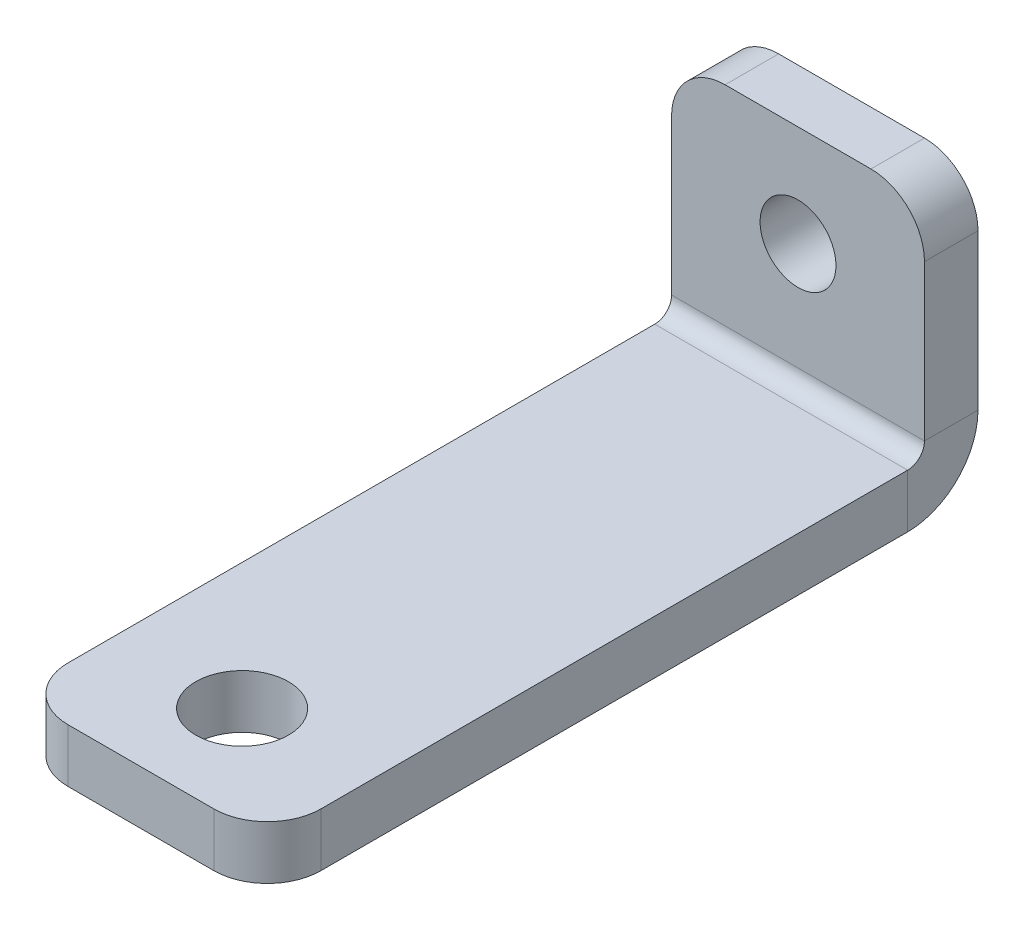
ISO-10303-21;
HEADER;
FILE_DESCRIPTION(('STEP AP214'),'2;1');
FILE_NAME('part.step','',(''),(''),'','','');
FILE_SCHEMA(('AUTOMOTIVE_DESIGN { 1 0 10303 214 1 1 1 1 }'));
ENDSEC;
DATA;
#1=APPLICATION_CONTEXT('core data for automotive mechanical design processes');
#2=APPLICATION_PROTOCOL_DEFINITION('international standard','automotive_design',2000,#1);
#3=PRODUCT_CONTEXT('',#1,'mechanical');
#4=PRODUCT('Part','Part','',(#3));
#5=PRODUCT_RELATED_PRODUCT_CATEGORY('part','',(#4));
#6=PRODUCT_DEFINITION_FORMATION('','',#4);
#7=PRODUCT_DEFINITION_CONTEXT('part definition',#1,'design');
#8=PRODUCT_DEFINITION('design','',#6,#7);
#9=PRODUCT_DEFINITION_SHAPE('','',#8);
#10=(LENGTH_UNIT() NAMED_UNIT(*) SI_UNIT(.MILLI.,.METRE.));
#11=(NAMED_UNIT(*) PLANE_ANGLE_UNIT() SI_UNIT($,.RADIAN.));
#12=(NAMED_UNIT(*) SI_UNIT($,.STERADIAN.) SOLID_ANGLE_UNIT());
#13=UNCERTAINTY_MEASURE_WITH_UNIT(LENGTH_MEASURE(1.E-05),#10,'distance_accuracy_value','');
#14=(GEOMETRIC_REPRESENTATION_CONTEXT(3) GLOBAL_UNCERTAINTY_ASSIGNED_CONTEXT((#13)) GLOBAL_UNIT_ASSIGNED_CONTEXT((#10,
#11,#12)) REPRESENTATION_CONTEXT('',''));
#15=CARTESIAN_POINT('',(0.,0.,0.));
#16=DIRECTION('',(0.,0.,1.));
#17=DIRECTION('',(1.,0.,0.));
#18=AXIS2_PLACEMENT_3D('',#15,#16,#17);
#19=CARTESIAN_POINT('',(7.5,3.175,21.075));
#20=DIRECTION('',(-1.,0.,0.));
#21=DIRECTION('',(0.,0.,1.));
#22=AXIS2_PLACEMENT_3D('',#19,#20,#21);
#23=PLANE('',#22);
#24=DIRECTION('',(0.,0.,-1.));
#25=VECTOR('',#24,1.);
#26=CARTESIAN_POINT('',(7.5,3.175,21.075));
#27=LINE('',#26,#25);
#28=CARTESIAN_POINT('',(7.5,3.175,17.9));
#29=VERTEX_POINT('',#28);
#30=CARTESIAN_POINT('',(7.5,3.17499999999999,-16.9));
#31=VERTEX_POINT('',#30);
#32=EDGE_CURVE('E246',#29,#31,#27,.T.);
#33=ORIENTED_EDGE('',*,*,#32,.F.);
#34=DIRECTION('',(0.,-1.,0.));
#35=VECTOR('',#34,1.);
#36=CARTESIAN_POINT('',(7.5,3.175,17.9));
#37=LINE('',#36,#35);
#38=CARTESIAN_POINT('',(7.5,0.,17.9));
#39=VERTEX_POINT('',#38);
#40=EDGE_CURVE('E13',#29,#39,#37,.T.);
#41=ORIENTED_EDGE('',*,*,#40,.T.);
#42=DIRECTION('',(0.,0.,-1.));
#43=VECTOR('',#42,1.);
#44=CARTESIAN_POINT('',(7.5,0.,21.075));
#45=LINE('',#44,#43);
#46=CARTESIAN_POINT('',(7.5,0.,-16.9));
#47=VERTEX_POINT('',#46);
#48=EDGE_CURVE('E243',#39,#47,#45,.T.);
#49=ORIENTED_EDGE('',*,*,#48,.T.);
#50=DIRECTION('',(0.,-1.,0.));
#51=VECTOR('',#50,1.);
#52=CARTESIAN_POINT('',(7.5,3.17499999999999,-16.9));
#53=LINE('',#52,#51);
#54=EDGE_CURVE('E239',#31,#47,#53,.T.);
#55=ORIENTED_EDGE('',*,*,#54,.F.);
#56=EDGE_LOOP('',(#33,#41,#49,#55));
#57=FACE_BOUND('',#56,.T.);
#58=ADVANCED_FACE('F67',(#57),#23,.F.);
#59=CARTESIAN_POINT('',(-7.5,3.175,21.075));
#60=DIRECTION('',(1.,0.,0.));
#61=DIRECTION('',(0.,0.,-1.));
#62=AXIS2_PLACEMENT_3D('',#59,#60,#61);
#63=PLANE('',#62);
#64=DIRECTION('',(0.,0.,1.));
#65=VECTOR('',#64,1.);
#66=CARTESIAN_POINT('',(-7.5,0.,21.075));
#67=LINE('',#66,#65);
#68=CARTESIAN_POINT('',(-7.5,0.,-16.9));
#69=VERTEX_POINT('',#68);
#70=CARTESIAN_POINT('',(-7.5,0.,17.9));
#71=VERTEX_POINT('',#70);
#72=EDGE_CURVE('E259',#69,#71,#67,.T.);
#73=ORIENTED_EDGE('',*,*,#72,.T.);
#74=DIRECTION('',(0.,-1.,0.));
#75=VECTOR('',#74,1.);
#76=CARTESIAN_POINT('',(-7.5,3.175,17.9));
#77=LINE('',#76,#75);
#78=CARTESIAN_POINT('',(-7.5,3.175,17.9));
#79=VERTEX_POINT('',#78);
#80=EDGE_CURVE('E91',#71,#79,#77,.F.);
#81=ORIENTED_EDGE('',*,*,#80,.T.);
#82=DIRECTION('',(0.,0.,1.));
#83=VECTOR('',#82,1.);
#84=CARTESIAN_POINT('',(-7.5,3.175,21.075));
#85=LINE('',#84,#83);
#86=CARTESIAN_POINT('',(-7.5,3.17499999999999,-16.9));
#87=VERTEX_POINT('',#86);
#88=EDGE_CURVE('E249',#87,#79,#85,.T.);
#89=ORIENTED_EDGE('',*,*,#88,.F.);
#90=DIRECTION('',(0.,-1.,0.));
#91=VECTOR('',#90,1.);
#92=CARTESIAN_POINT('',(-7.5,3.17499999999999,-16.9));
#93=LINE('',#92,#91);
#94=EDGE_CURVE('E228',#87,#69,#93,.T.);
#95=ORIENTED_EDGE('',*,*,#94,.T.);
#96=EDGE_LOOP('',(#73,#81,#89,#95));
#97=FACE_BOUND('',#96,.T.);
#98=ADVANCED_FACE('F320',(#97),#63,.F.);
#99=CARTESIAN_POINT('',(0.,3.175,0.));
#100=DIRECTION('',(0.,-1.,0.));
#101=DIRECTION('',(0.,0.,-1.));
#102=AXIS2_PLACEMENT_3D('',#99,#100,#101);
#103=PLANE('',#102);
#104=CARTESIAN_POINT('',(0.,3.175,15.075));
#105=DIRECTION('',(0.,1.,0.));
#106=DIRECTION('',(0.,0.,1.));
#107=AXIS2_PLACEMENT_3D('',#104,#105,#106);
#108=CIRCLE('',#107,2.75);
#109=CARTESIAN_POINT('',(0.,3.175,17.825));
#110=VERTEX_POINT('',#109);
#111=EDGE_CURVE('E355',#110,#110,#108,.T.);
#112=ORIENTED_EDGE('',*,*,#111,.F.);
#113=EDGE_LOOP('',(#112));
#114=FACE_BOUND('',#113,.T.);
#115=ORIENTED_EDGE('',*,*,#88,.T.);
#116=CARTESIAN_POINT('',(-4.325,3.175,17.9));
#117=DIRECTION('',(0.,-1.,0.));
#118=DIRECTION('',(0.,0.,-1.));
#119=AXIS2_PLACEMENT_3D('',#116,#117,#118);
#120=CIRCLE('',#119,3.175);
#121=CARTESIAN_POINT('',(-4.325,3.175,21.075));
#122=VERTEX_POINT('',#121);
#123=EDGE_CURVE('E76',#79,#122,#120,.F.);
#124=ORIENTED_EDGE('',*,*,#123,.T.);
#125=DIRECTION('',(1.,0.,0.));
#126=VECTOR('',#125,1.);
#127=CARTESIAN_POINT('',(-7.5,3.175,21.075));
#128=LINE('',#127,#126);
#129=CARTESIAN_POINT('',(4.325,3.175,21.075));
#130=VERTEX_POINT('',#129);
#131=EDGE_CURVE('E253',#122,#130,#128,.T.);
#132=ORIENTED_EDGE('',*,*,#131,.T.);
#133=CARTESIAN_POINT('',(4.325,3.175,17.9));
#134=DIRECTION('',(0.,-1.,0.));
#135=DIRECTION('',(0.,0.,-1.));
#136=AXIS2_PLACEMENT_3D('',#133,#134,#135);
#137=CIRCLE('',#136,3.175);
#138=EDGE_CURVE('E83',#130,#29,#137,.F.);
#139=ORIENTED_EDGE('',*,*,#138,.T.);
#140=ORIENTED_EDGE('',*,*,#32,.T.);
#141=DIRECTION('',(-1.,0.,0.));
#142=VECTOR('',#141,1.);
#143=CARTESIAN_POINT('',(-7.5,3.17499999999999,-16.9));
#144=LINE('',#143,#142);
#145=EDGE_CURVE('E233',#87,#31,#144,.F.);
#146=ORIENTED_EDGE('',*,*,#145,.F.);
#147=EDGE_LOOP('',(#115,#124,#132,#139,#140,#146));
#148=FACE_BOUND('',#147,.T.);
#149=ADVANCED_FACE('F308',(#114,#148),#103,.F.);
#150=CARTESIAN_POINT('',(0.,0.,0.));
#151=DIRECTION('',(0.,-1.,0.));
#152=DIRECTION('',(0.,0.,-1.));
#153=AXIS2_PLACEMENT_3D('',#150,#151,#152);
#154=PLANE('',#153);
#155=CARTESIAN_POINT('',(0.,0.,15.075));
#156=DIRECTION('',(0.,1.,0.));
#157=DIRECTION('',(0.,0.,1.));
#158=AXIS2_PLACEMENT_3D('',#155,#156,#157);
#159=CIRCLE('',#158,2.75);
#160=CARTESIAN_POINT('',(0.,0.,17.825));
#161=VERTEX_POINT('',#160);
#162=EDGE_CURVE('E223',#161,#161,#159,.T.);
#163=ORIENTED_EDGE('',*,*,#162,.T.);
#164=EDGE_LOOP('',(#163));
#165=FACE_BOUND('',#164,.T.);
#166=DIRECTION('',(1.,0.,0.));
#167=VECTOR('',#166,1.);
#168=CARTESIAN_POINT('',(-7.5,0.,21.075));
#169=LINE('',#168,#167);
#170=CARTESIAN_POINT('',(-4.325,0.,21.075));
#171=VERTEX_POINT('',#170);
#172=CARTESIAN_POINT('',(4.325,0.,21.075));
#173=VERTEX_POINT('',#172);
#174=EDGE_CURVE('E250',#171,#173,#169,.T.);
#175=ORIENTED_EDGE('',*,*,#174,.F.);
#176=CARTESIAN_POINT('',(-4.325,0.,17.9));
#177=DIRECTION('',(0.,-1.,0.));
#178=DIRECTION('',(0.,0.,-1.));
#179=AXIS2_PLACEMENT_3D('',#176,#177,#178);
#180=CIRCLE('',#179,3.175);
#181=EDGE_CURVE('E299',#171,#71,#180,.T.);
#182=ORIENTED_EDGE('',*,*,#181,.T.);
#183=ORIENTED_EDGE('',*,*,#72,.F.);
#184=DIRECTION('',(-1.,0.,0.));
#185=VECTOR('',#184,1.);
#186=CARTESIAN_POINT('',(-7.5,0.,-16.9));
#187=LINE('',#186,#185);
#188=EDGE_CURVE('E168',#69,#47,#187,.F.);
#189=ORIENTED_EDGE('',*,*,#188,.T.);
#190=ORIENTED_EDGE('',*,*,#48,.F.);
#191=CARTESIAN_POINT('',(4.325,0.,17.9));
#192=DIRECTION('',(0.,-1.,0.));
#193=DIRECTION('',(0.,0.,-1.));
#194=AXIS2_PLACEMENT_3D('',#191,#192,#193);
#195=CIRCLE('',#194,3.175);
#196=EDGE_CURVE('E296',#39,#173,#195,.T.);
#197=ORIENTED_EDGE('',*,*,#196,.T.);
#198=EDGE_LOOP('',(#175,#182,#183,#189,#190,#197));
#199=FACE_BOUND('',#198,.T.);
#200=ADVANCED_FACE('F319',(#165,#199),#154,.T.);
#201=CARTESIAN_POINT('',(-7.5,3.175,21.075));
#202=DIRECTION('',(0.,0.,-1.));
#203=DIRECTION('',(-1.,0.,0.));
#204=AXIS2_PLACEMENT_3D('',#201,#202,#203);
#205=PLANE('',#204);
#206=ORIENTED_EDGE('',*,*,#131,.F.);
#207=DIRECTION('',(0.,-1.,0.));
#208=VECTOR('',#207,1.);
#209=CARTESIAN_POINT('',(-4.325,3.175,21.075));
#210=LINE('',#209,#208);
#211=EDGE_CURVE('E292',#122,#171,#210,.T.);
#212=ORIENTED_EDGE('',*,*,#211,.T.);
#213=ORIENTED_EDGE('',*,*,#174,.T.);
#214=DIRECTION('',(0.,-1.,0.));
#215=VECTOR('',#214,1.);
#216=CARTESIAN_POINT('',(4.325,3.175,21.075));
#217=LINE('',#216,#215);
#218=EDGE_CURVE('E289',#173,#130,#217,.F.);
#219=ORIENTED_EDGE('',*,*,#218,.T.);
#220=EDGE_LOOP('',(#206,#212,#213,#219));
#221=FACE_BOUND('',#220,.T.);
#222=ADVANCED_FACE('F313',(#221),#205,.F.);
#223=CARTESIAN_POINT('',(7.5,4.17499999999999,-16.9));
#224=DIRECTION('',(1.,0.,0.));
#225=DIRECTION('',(0.,0.,-1.));
#226=AXIS2_PLACEMENT_3D('',#223,#224,#225);
#227=PLANE('',#226);
#228=DIRECTION('',(0.,0.,1.));
#229=VECTOR('',#228,1.);
#230=CARTESIAN_POINT('',(7.5,4.17500000000002,-21.075));
#231=LINE('',#230,#229);
#232=CARTESIAN_POINT('',(7.5,4.17499999999999,-17.9));
#233=VERTEX_POINT('',#232);
#234=CARTESIAN_POINT('',(7.5,4.17499999999998,-21.075));
#235=VERTEX_POINT('',#234);
#236=EDGE_CURVE('E219',#233,#235,#231,.F.);
#237=ORIENTED_EDGE('',*,*,#236,.F.);
#238=CARTESIAN_POINT('',(7.5,4.17499999999999,-16.9));
#239=DIRECTION('',(-1.,0.,0.));
#240=DIRECTION('',(0.,0.,1.));
#241=AXIS2_PLACEMENT_3D('',#238,#239,#240);
#242=CIRCLE('',#241,1.);
#243=EDGE_CURVE('E172',#31,#233,#242,.F.);
#244=ORIENTED_EDGE('',*,*,#243,.F.);
#245=ORIENTED_EDGE('',*,*,#54,.T.);
#246=CARTESIAN_POINT('',(7.5,4.17499999999999,-16.9));
#247=DIRECTION('',(-1.,0.,0.));
#248=DIRECTION('',(0.,0.,1.));
#249=AXIS2_PLACEMENT_3D('',#246,#247,#248);
#250=CIRCLE('',#249,4.175);
#251=EDGE_CURVE('E226',#47,#235,#250,.F.);
#252=ORIENTED_EDGE('',*,*,#251,.T.);
#253=EDGE_LOOP('',(#237,#244,#245,#252));
#254=FACE_BOUND('',#253,.T.);
#255=ADVANCED_FACE('F332',(#254),#227,.T.);
#256=CARTESIAN_POINT('',(-7.5,4.17499999999999,-16.9));
#257=DIRECTION('',(1.,0.,0.));
#258=DIRECTION('',(0.,0.,-1.));
#259=AXIS2_PLACEMENT_3D('',#256,#257,#258);
#260=PLANE('',#259);
#261=CARTESIAN_POINT('',(-7.5,4.17499999999999,-16.9));
#262=DIRECTION('',(-1.,0.,0.));
#263=DIRECTION('',(0.,0.,1.));
#264=AXIS2_PLACEMENT_3D('',#261,#262,#263);
#265=CIRCLE('',#264,1.);
#266=CARTESIAN_POINT('',(-7.5,4.17499999999999,-17.9));
#267=VERTEX_POINT('',#266);
#268=EDGE_CURVE('E179',#267,#87,#265,.T.);
#269=ORIENTED_EDGE('',*,*,#268,.F.);
#270=DIRECTION('',(0.,0.,1.));
#271=VECTOR('',#270,1.);
#272=CARTESIAN_POINT('',(-7.5,4.175,-17.9));
#273=LINE('',#272,#271);
#274=CARTESIAN_POINT('',(-7.5,4.17500000000002,-21.075));
#275=VERTEX_POINT('',#274);
#276=EDGE_CURVE('E176',#267,#275,#273,.F.);
#277=ORIENTED_EDGE('',*,*,#276,.T.);
#278=CARTESIAN_POINT('',(-7.5,4.17499999999999,-16.9));
#279=DIRECTION('',(-1.,0.,0.));
#280=DIRECTION('',(0.,0.,1.));
#281=AXIS2_PLACEMENT_3D('',#278,#279,#280);
#282=CIRCLE('',#281,4.175);
#283=EDGE_CURVE('E160',#275,#69,#282,.T.);
#284=ORIENTED_EDGE('',*,*,#283,.T.);
#285=ORIENTED_EDGE('',*,*,#94,.F.);
#286=EDGE_LOOP('',(#269,#277,#284,#285));
#287=FACE_BOUND('',#286,.T.);
#288=ADVANCED_FACE('F177',(#287),#260,.F.);
#289=CARTESIAN_POINT('',(-7.5,4.17499999999999,-16.9));
#290=DIRECTION('',(-1.,0.,0.));
#291=DIRECTION('',(0.,0.,-1.));
#292=AXIS2_PLACEMENT_3D('',#289,#290,#291);
#293=CYLINDRICAL_SURFACE('',#292,4.175);
#294=ORIENTED_EDGE('',*,*,#188,.F.);
#295=ORIENTED_EDGE('',*,*,#283,.F.);
#296=DIRECTION('',(-1.,0.,0.));
#297=VECTOR('',#296,1.);
#298=CARTESIAN_POINT('',(7.5,4.17500000000002,-21.075));
#299=LINE('',#298,#297);
#300=EDGE_CURVE('E165',#275,#235,#299,.F.);
#301=ORIENTED_EDGE('',*,*,#300,.T.);
#302=ORIENTED_EDGE('',*,*,#251,.F.);
#303=EDGE_LOOP('',(#294,#295,#301,#302));
#304=FACE_BOUND('',#303,.T.);
#305=ADVANCED_FACE('F162',(#304),#293,.T.);
#306=CARTESIAN_POINT('',(-7.5,4.17499999999999,-16.9));
#307=DIRECTION('',(-1.,0.,0.));
#308=DIRECTION('',(0.,0.,-1.));
#309=AXIS2_PLACEMENT_3D('',#306,#307,#308);
#310=CYLINDRICAL_SURFACE('',#309,1.);
#311=ORIENTED_EDGE('',*,*,#145,.T.);
#312=ORIENTED_EDGE('',*,*,#243,.T.);
#313=DIRECTION('',(-1.,0.,0.));
#314=VECTOR('',#313,1.);
#315=CARTESIAN_POINT('',(7.5,4.175,-17.9));
#316=LINE('',#315,#314);
#317=EDGE_CURVE('E185',#233,#267,#316,.T.);
#318=ORIENTED_EDGE('',*,*,#317,.T.);
#319=ORIENTED_EDGE('',*,*,#268,.T.);
#320=EDGE_LOOP('',(#311,#312,#318,#319));
#321=FACE_BOUND('',#320,.T.);
#322=ADVANCED_FACE('F322',(#321),#310,.F.);
#323=CARTESIAN_POINT('',(-7.5,16.56,-21.075));
#324=DIRECTION('',(1.,0.,0.));
#325=DIRECTION('',(0.,1.,0.));
#326=AXIS2_PLACEMENT_3D('',#323,#324,#325);
#327=PLANE('',#326);
#328=DIRECTION('',(0.,-1.,0.));
#329=VECTOR('',#328,1.);
#330=CARTESIAN_POINT('',(-7.5,16.56,-17.9));
#331=LINE('',#330,#329);
#332=CARTESIAN_POINT('',(-7.5,13.385,-17.9));
#333=VERTEX_POINT('',#332);
#334=EDGE_CURVE('E195',#267,#333,#331,.F.);
#335=ORIENTED_EDGE('',*,*,#334,.T.);
#336=DIRECTION('',(0.,0.,1.));
#337=VECTOR('',#336,1.);
#338=CARTESIAN_POINT('',(-7.5,13.385,-21.075));
#339=LINE('',#338,#337);
#340=CARTESIAN_POINT('',(-7.5,13.385,-21.075));
#341=VERTEX_POINT('',#340);
#342=EDGE_CURVE('E199',#333,#341,#339,.F.);
#343=ORIENTED_EDGE('',*,*,#342,.T.);
#344=DIRECTION('',(0.,1.,0.));
#345=VECTOR('',#344,1.);
#346=CARTESIAN_POINT('',(-7.5,0.,-21.075));
#347=LINE('',#346,#345);
#348=EDGE_CURVE('E190',#275,#341,#347,.T.);
#349=ORIENTED_EDGE('',*,*,#348,.F.);
#350=ORIENTED_EDGE('',*,*,#276,.F.);
#351=EDGE_LOOP('',(#335,#343,#349,#350));
#352=FACE_BOUND('',#351,.T.);
#353=ADVANCED_FACE('F197',(#352),#327,.F.);
#354=CARTESIAN_POINT('',(7.5,3.17499999999999,-21.075));
#355=DIRECTION('',(-1.,0.,0.));
#356=DIRECTION('',(0.,0.,1.));
#357=AXIS2_PLACEMENT_3D('',#354,#355,#356);
#358=PLANE('',#357);
#359=DIRECTION('',(0.,-1.,0.));
#360=VECTOR('',#359,1.);
#361=CARTESIAN_POINT('',(7.5,0.,-21.075));
#362=LINE('',#361,#360);
#363=CARTESIAN_POINT('',(7.5,13.385,-21.075));
#364=VERTEX_POINT('',#363);
#365=EDGE_CURVE('E193',#364,#235,#362,.T.);
#366=ORIENTED_EDGE('',*,*,#365,.F.);
#367=DIRECTION('',(0.,0.,1.));
#368=VECTOR('',#367,1.);
#369=CARTESIAN_POINT('',(7.5,13.385,-21.075));
#370=LINE('',#369,#368);
#371=CARTESIAN_POINT('',(7.5,13.385,-17.9));
#372=VERTEX_POINT('',#371);
#373=EDGE_CURVE('E285',#364,#372,#370,.T.);
#374=ORIENTED_EDGE('',*,*,#373,.T.);
#375=DIRECTION('',(0.,1.,0.));
#376=VECTOR('',#375,1.);
#377=CARTESIAN_POINT('',(7.5,3.175,-17.9));
#378=LINE('',#377,#376);
#379=EDGE_CURVE('E202',#372,#233,#378,.F.);
#380=ORIENTED_EDGE('',*,*,#379,.T.);
#381=ORIENTED_EDGE('',*,*,#236,.T.);
#382=EDGE_LOOP('',(#366,#374,#380,#381));
#383=FACE_BOUND('',#382,.T.);
#384=ADVANCED_FACE('F349',(#383),#358,.F.);
#385=CARTESIAN_POINT('',(0.,0.,-21.075));
#386=DIRECTION('',(0.,0.,1.));
#387=DIRECTION('',(0.,-1.,0.));
#388=AXIS2_PLACEMENT_3D('',#385,#386,#387);
#389=PLANE('',#388);
#390=CARTESIAN_POINT('',(0.,10.56,-21.075));
#391=DIRECTION('',(0.,0.,1.));
#392=DIRECTION('',(1.,0.,0.));
#393=AXIS2_PLACEMENT_3D('',#390,#391,#392);
#394=CIRCLE('',#393,2.25);
#395=CARTESIAN_POINT('',(2.25,10.56,-21.075));
#396=VERTEX_POINT('',#395);
#397=EDGE_CURVE('E359',#396,#396,#394,.T.);
#398=ORIENTED_EDGE('',*,*,#397,.T.);
#399=EDGE_LOOP('',(#398));
#400=FACE_BOUND('',#399,.T.);
#401=ORIENTED_EDGE('',*,*,#348,.T.);
#402=CARTESIAN_POINT('',(-4.325,13.385,-21.075));
#403=DIRECTION('',(0.,0.,1.));
#404=DIRECTION('',(0.,-1.,0.));
#405=AXIS2_PLACEMENT_3D('',#402,#403,#404);
#406=CIRCLE('',#405,3.175);
#407=CARTESIAN_POINT('',(-4.325,16.56,-21.075));
#408=VERTEX_POINT('',#407);
#409=EDGE_CURVE('E282',#341,#408,#406,.F.);
#410=ORIENTED_EDGE('',*,*,#409,.T.);
#411=DIRECTION('',(1.,0.,0.));
#412=VECTOR('',#411,1.);
#413=CARTESIAN_POINT('',(0.,16.56,-21.075));
#414=LINE('',#413,#412);
#415=CARTESIAN_POINT('',(4.325,16.56,-21.075));
#416=VERTEX_POINT('',#415);
#417=EDGE_CURVE('E201',#408,#416,#414,.T.);
#418=ORIENTED_EDGE('',*,*,#417,.T.);
#419=CARTESIAN_POINT('',(4.325,13.385,-21.075));
#420=DIRECTION('',(0.,0.,1.));
#421=DIRECTION('',(0.,-1.,0.));
#422=AXIS2_PLACEMENT_3D('',#419,#420,#421);
#423=CIRCLE('',#422,3.175);
#424=EDGE_CURVE('E279',#416,#364,#423,.F.);
#425=ORIENTED_EDGE('',*,*,#424,.T.);
#426=ORIENTED_EDGE('',*,*,#365,.T.);
#427=ORIENTED_EDGE('',*,*,#300,.F.);
#428=EDGE_LOOP('',(#401,#410,#418,#425,#426,#427));
#429=FACE_BOUND('',#428,.T.);
#430=ADVANCED_FACE('F189',(#400,#429),#389,.F.);
#431=CARTESIAN_POINT('',(0.,0.,-17.9));
#432=DIRECTION('',(0.,0.,1.));
#433=DIRECTION('',(0.,-1.,0.));
#434=AXIS2_PLACEMENT_3D('',#431,#432,#433);
#435=PLANE('',#434);
#436=CARTESIAN_POINT('',(0.,10.56,-17.9));
#437=DIRECTION('',(0.,0.,1.));
#438=DIRECTION('',(1.,0.,0.));
#439=AXIS2_PLACEMENT_3D('',#436,#437,#438);
#440=CIRCLE('',#439,2.24999999999999);
#441=CARTESIAN_POINT('',(2.24999999999999,10.56,-17.9));
#442=VERTEX_POINT('',#441);
#443=EDGE_CURVE('E363',#442,#442,#440,.T.);
#444=ORIENTED_EDGE('',*,*,#443,.F.);
#445=EDGE_LOOP('',(#444));
#446=FACE_BOUND('',#445,.T.);
#447=DIRECTION('',(-1.,0.,0.));
#448=VECTOR('',#447,1.);
#449=CARTESIAN_POINT('',(7.5,16.56,-17.9));
#450=LINE('',#449,#448);
#451=CARTESIAN_POINT('',(-4.325,16.56,-17.9));
#452=VERTEX_POINT('',#451);
#453=CARTESIAN_POINT('',(4.325,16.56,-17.9));
#454=VERTEX_POINT('',#453);
#455=EDGE_CURVE('E208',#452,#454,#450,.F.);
#456=ORIENTED_EDGE('',*,*,#455,.F.);
#457=CARTESIAN_POINT('',(-4.325,13.385,-17.9));
#458=DIRECTION('',(0.,0.,1.));
#459=DIRECTION('',(0.,-1.,0.));
#460=AXIS2_PLACEMENT_3D('',#457,#458,#459);
#461=CIRCLE('',#460,3.175);
#462=EDGE_CURVE('E274',#452,#333,#461,.T.);
#463=ORIENTED_EDGE('',*,*,#462,.T.);
#464=ORIENTED_EDGE('',*,*,#334,.F.);
#465=ORIENTED_EDGE('',*,*,#317,.F.);
#466=ORIENTED_EDGE('',*,*,#379,.F.);
#467=CARTESIAN_POINT('',(4.325,13.385,-17.9));
#468=DIRECTION('',(0.,0.,1.));
#469=DIRECTION('',(0.,-1.,0.));
#470=AXIS2_PLACEMENT_3D('',#467,#468,#469);
#471=CIRCLE('',#470,3.175);
#472=EDGE_CURVE('E271',#372,#454,#471,.T.);
#473=ORIENTED_EDGE('',*,*,#472,.T.);
#474=EDGE_LOOP('',(#456,#463,#464,#465,#466,#473));
#475=FACE_BOUND('',#474,.T.);
#476=ADVANCED_FACE('F336',(#446,#475),#435,.T.);
#477=CARTESIAN_POINT('',(7.5,16.56,-21.075));
#478=DIRECTION('',(0.,-1.,0.));
#479=DIRECTION('',(0.,0.,-1.));
#480=AXIS2_PLACEMENT_3D('',#477,#478,#479);
#481=PLANE('',#480);
#482=ORIENTED_EDGE('',*,*,#417,.F.);
#483=DIRECTION('',(0.,0.,1.));
#484=VECTOR('',#483,1.);
#485=CARTESIAN_POINT('',(-4.325,16.56,-21.075));
#486=LINE('',#485,#484);
#487=EDGE_CURVE('E267',#408,#452,#486,.T.);
#488=ORIENTED_EDGE('',*,*,#487,.T.);
#489=ORIENTED_EDGE('',*,*,#455,.T.);
#490=DIRECTION('',(0.,0.,1.));
#491=VECTOR('',#490,1.);
#492=CARTESIAN_POINT('',(4.325,16.56,-21.075));
#493=LINE('',#492,#491);
#494=EDGE_CURVE('E256',#454,#416,#493,.F.);
#495=ORIENTED_EDGE('',*,*,#494,.T.);
#496=EDGE_LOOP('',(#482,#488,#489,#495));
#497=FACE_BOUND('',#496,.T.);
#498=ADVANCED_FACE('F343',(#497),#481,.F.);
#499=CARTESIAN_POINT('',(0.,3.175,15.075));
#500=DIRECTION('',(0.,1.,0.));
#501=DIRECTION('',(0.,0.,1.));
#502=AXIS2_PLACEMENT_3D('',#499,#500,#501);
#503=CYLINDRICAL_SURFACE('',#502,2.75);
#504=ORIENTED_EDGE('',*,*,#162,.F.);
#505=EDGE_LOOP('',(#504));
#506=FACE_BOUND('',#505,.T.);
#507=ORIENTED_EDGE('',*,*,#111,.T.);
#508=EDGE_LOOP('',(#507));
#509=FACE_BOUND('',#508,.T.);
#510=ADVANCED_FACE('F376',(#506,#509),#503,.F.);
#511=CARTESIAN_POINT('',(0.,10.56,-17.9));
#512=DIRECTION('',(0.,0.,1.));
#513=DIRECTION('',(1.,0.,0.));
#514=AXIS2_PLACEMENT_3D('',#511,#512,#513);
#515=CYLINDRICAL_SURFACE('',#514,2.24999999999999);
#516=ORIENTED_EDGE('',*,*,#397,.F.);
#517=EDGE_LOOP('',(#516));
#518=FACE_BOUND('',#517,.T.);
#519=ORIENTED_EDGE('',*,*,#443,.T.);
#520=EDGE_LOOP('',(#519));
#521=FACE_BOUND('',#520,.T.);
#522=ADVANCED_FACE('F368',(#518,#521),#515,.F.);
#523=CARTESIAN_POINT('',(-4.325,13.385,-21.075));
#524=DIRECTION('',(0.,0.,1.));
#525=DIRECTION('',(0.,-1.,0.));
#526=AXIS2_PLACEMENT_3D('',#523,#524,#525);
#527=CYLINDRICAL_SURFACE('',#526,3.175);
#528=ORIENTED_EDGE('',*,*,#409,.F.);
#529=ORIENTED_EDGE('',*,*,#342,.F.);
#530=ORIENTED_EDGE('',*,*,#462,.F.);
#531=ORIENTED_EDGE('',*,*,#487,.F.);
#532=EDGE_LOOP('',(#528,#529,#530,#531));
#533=FACE_BOUND('',#532,.T.);
#534=ADVANCED_FACE('F338',(#533),#527,.T.);
#535=CARTESIAN_POINT('',(4.325,13.385,-21.075));
#536=DIRECTION('',(0.,0.,1.));
#537=DIRECTION('',(0.,-1.,0.));
#538=AXIS2_PLACEMENT_3D('',#535,#536,#537);
#539=CYLINDRICAL_SURFACE('',#538,3.175);
#540=ORIENTED_EDGE('',*,*,#424,.F.);
#541=ORIENTED_EDGE('',*,*,#494,.F.);
#542=ORIENTED_EDGE('',*,*,#472,.F.);
#543=ORIENTED_EDGE('',*,*,#373,.F.);
#544=EDGE_LOOP('',(#540,#541,#542,#543));
#545=FACE_BOUND('',#544,.T.);
#546=ADVANCED_FACE('F346',(#545),#539,.T.);
#547=CARTESIAN_POINT('',(-4.325,3.175,17.9));
#548=DIRECTION('',(0.,-1.,0.));
#549=DIRECTION('',(0.,0.,-1.));
#550=AXIS2_PLACEMENT_3D('',#547,#548,#549);
#551=CYLINDRICAL_SURFACE('',#550,3.175);
#552=ORIENTED_EDGE('',*,*,#123,.F.);
#553=ORIENTED_EDGE('',*,*,#80,.F.);
#554=ORIENTED_EDGE('',*,*,#181,.F.);
#555=ORIENTED_EDGE('',*,*,#211,.F.);
#556=EDGE_LOOP('',(#552,#553,#554,#555));
#557=FACE_BOUND('',#556,.T.);
#558=ADVANCED_FACE('F316',(#557),#551,.T.);
#559=CARTESIAN_POINT('',(4.325,3.175,17.9));
#560=DIRECTION('',(0.,-1.,0.));
#561=DIRECTION('',(0.,0.,-1.));
#562=AXIS2_PLACEMENT_3D('',#559,#560,#561);
#563=CYLINDRICAL_SURFACE('',#562,3.175);
#564=ORIENTED_EDGE('',*,*,#138,.F.);
#565=ORIENTED_EDGE('',*,*,#218,.F.);
#566=ORIENTED_EDGE('',*,*,#196,.F.);
#567=ORIENTED_EDGE('',*,*,#40,.F.);
#568=EDGE_LOOP('',(#564,#565,#566,#567));
#569=FACE_BOUND('',#568,.T.);
#570=ADVANCED_FACE('F69',(#569),#563,.T.);
#571=CLOSED_SHELL('',(#58,#98,#149,#200,#222,#255,#288,#305,#322,#353,#384,#430,#476,#498,#510,
#522,#534,#546,#558,#570));
#572=MANIFOLD_SOLID_BREP('B2',#571);
#573=ADVANCED_BREP_SHAPE_REPRESENTATION('',(#18,#572),#14);
#574=SHAPE_DEFINITION_REPRESENTATION(#9,#573);
ENDSEC;
END-ISO-10303-21;
